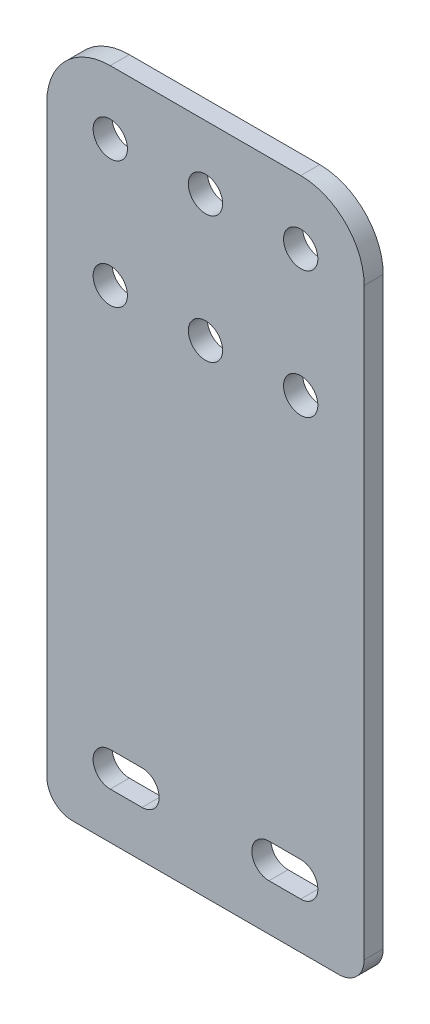
ISO-10303-21;
HEADER;
FILE_DESCRIPTION(('STEP AP214'),'2;1');
FILE_NAME('part.step','',(''),(''),'','','');
FILE_SCHEMA(('AUTOMOTIVE_DESIGN { 1 0 10303 214 1 1 1 1 }'));
ENDSEC;
DATA;
#1=APPLICATION_CONTEXT('core data for automotive mechanical design processes');
#2=APPLICATION_PROTOCOL_DEFINITION('international standard','automotive_design',2000,#1);
#3=PRODUCT_CONTEXT('',#1,'mechanical');
#4=PRODUCT('Part','Part','',(#3));
#5=PRODUCT_RELATED_PRODUCT_CATEGORY('part','',(#4));
#6=PRODUCT_DEFINITION_FORMATION('','',#4);
#7=PRODUCT_DEFINITION_CONTEXT('part definition',#1,'design');
#8=PRODUCT_DEFINITION('design','',#6,#7);
#9=PRODUCT_DEFINITION_SHAPE('','',#8);
#10=(LENGTH_UNIT() NAMED_UNIT(*) SI_UNIT(.MILLI.,.METRE.));
#11=(NAMED_UNIT(*) PLANE_ANGLE_UNIT() SI_UNIT($,.RADIAN.));
#12=(NAMED_UNIT(*) SI_UNIT($,.STERADIAN.) SOLID_ANGLE_UNIT());
#13=UNCERTAINTY_MEASURE_WITH_UNIT(LENGTH_MEASURE(1.E-05),#10,'distance_accuracy_value','');
#14=(GEOMETRIC_REPRESENTATION_CONTEXT(3) GLOBAL_UNCERTAINTY_ASSIGNED_CONTEXT((#13)) GLOBAL_UNIT_ASSIGNED_CONTEXT((#10,
#11,#12)) REPRESENTATION_CONTEXT('',''));
#15=CARTESIAN_POINT('',(0.,0.,0.));
#16=DIRECTION('',(0.,0.,1.));
#17=DIRECTION('',(1.,0.,0.));
#18=AXIS2_PLACEMENT_3D('',#15,#16,#17);
#19=CARTESIAN_POINT('',(10.,96.,3.));
#20=DIRECTION('',(0.,0.,1.));
#21=DIRECTION('',(1.,0.,0.));
#22=AXIS2_PLACEMENT_3D('',#19,#20,#21);
#23=PLANE('',#22);
#24=DIRECTION('',(1.,0.,0.));
#25=VECTOR('',#24,1.);
#26=CARTESIAN_POINT('',(15.,7.3,3.));
#27=LINE('',#26,#25);
#28=CARTESIAN_POINT('',(9.99999999999999,7.3,3.));
#29=VERTEX_POINT('',#28);
#30=CARTESIAN_POINT('',(15.,7.3,3.));
#31=VERTEX_POINT('',#30);
#32=EDGE_CURVE('E184',#29,#31,#27,.T.);
#33=ORIENTED_EDGE('',*,*,#32,.F.);
#34=CARTESIAN_POINT('',(10.,10.,3.));
#35=DIRECTION('',(0.,0.,1.));
#36=DIRECTION('',(1.,0.,0.));
#37=AXIS2_PLACEMENT_3D('',#34,#35,#36);
#38=CIRCLE('',#37,2.7);
#39=CARTESIAN_POINT('',(10.,12.7,3.));
#40=VERTEX_POINT('',#39);
#41=EDGE_CURVE('E182',#40,#29,#38,.T.);
#42=ORIENTED_EDGE('',*,*,#41,.F.);
#43=DIRECTION('',(-1.,0.,0.));
#44=VECTOR('',#43,1.);
#45=CARTESIAN_POINT('',(10.,12.7,3.));
#46=LINE('',#45,#44);
#47=CARTESIAN_POINT('',(15.,12.7,3.));
#48=VERTEX_POINT('',#47);
#49=EDGE_CURVE('E190',#48,#40,#46,.T.);
#50=ORIENTED_EDGE('',*,*,#49,.F.);
#51=CARTESIAN_POINT('',(15.,10.,3.));
#52=DIRECTION('',(0.,0.,1.));
#53=DIRECTION('',(1.,0.,0.));
#54=AXIS2_PLACEMENT_3D('',#51,#52,#53);
#55=CIRCLE('',#54,2.7);
#56=EDGE_CURVE('E187',#31,#48,#55,.T.);
#57=ORIENTED_EDGE('',*,*,#56,.F.);
#58=EDGE_LOOP('',(#33,#42,#50,#57));
#59=FACE_BOUND('',#58,.T.);
#60=CARTESIAN_POINT('',(10.,76.,3.));
#61=DIRECTION('',(0.,0.,1.));
#62=DIRECTION('',(1.,0.,0.));
#63=AXIS2_PLACEMENT_3D('',#60,#61,#62);
#64=CIRCLE('',#63,2.7);
#65=CARTESIAN_POINT('',(12.7,76.,3.));
#66=VERTEX_POINT('',#65);
#67=EDGE_CURVE('E219',#66,#66,#64,.T.);
#68=ORIENTED_EDGE('',*,*,#67,.F.);
#69=EDGE_LOOP('',(#68));
#70=FACE_BOUND('',#69,.T.);
#71=CARTESIAN_POINT('',(40.,76.,3.));
#72=DIRECTION('',(0.,0.,1.));
#73=DIRECTION('',(1.,0.,0.));
#74=AXIS2_PLACEMENT_3D('',#71,#72,#73);
#75=CIRCLE('',#74,2.7);
#76=CARTESIAN_POINT('',(42.7,76.,3.));
#77=VERTEX_POINT('',#76);
#78=EDGE_CURVE('E231',#77,#77,#75,.T.);
#79=ORIENTED_EDGE('',*,*,#78,.F.);
#80=EDGE_LOOP('',(#79));
#81=FACE_BOUND('',#80,.T.);
#82=CARTESIAN_POINT('',(25.,76.,3.));
#83=DIRECTION('',(0.,0.,1.));
#84=DIRECTION('',(1.,0.,0.));
#85=AXIS2_PLACEMENT_3D('',#82,#83,#84);
#86=CIRCLE('',#85,2.7);
#87=CARTESIAN_POINT('',(27.7,76.,3.));
#88=VERTEX_POINT('',#87);
#89=EDGE_CURVE('E243',#88,#88,#86,.T.);
#90=ORIENTED_EDGE('',*,*,#89,.F.);
#91=EDGE_LOOP('',(#90));
#92=FACE_BOUND('',#91,.T.);
#93=CARTESIAN_POINT('',(10.,96.,3.));
#94=DIRECTION('',(0.,0.,1.));
#95=DIRECTION('',(1.,0.,0.));
#96=AXIS2_PLACEMENT_3D('',#93,#94,#95);
#97=CIRCLE('',#96,10.);
#98=CARTESIAN_POINT('',(10.,106.,3.));
#99=VERTEX_POINT('',#98);
#100=CARTESIAN_POINT('',(0.,96.,3.));
#101=VERTEX_POINT('',#100);
#102=EDGE_CURVE('E249',#99,#101,#97,.T.);
#103=ORIENTED_EDGE('',*,*,#102,.T.);
#104=DIRECTION('',(0.,-1.,0.));
#105=VECTOR('',#104,1.);
#106=CARTESIAN_POINT('',(0.,96.,3.));
#107=LINE('',#106,#105);
#108=CARTESIAN_POINT('',(0.,4.,3.));
#109=VERTEX_POINT('',#108);
#110=EDGE_CURVE('E252',#101,#109,#107,.T.);
#111=ORIENTED_EDGE('',*,*,#110,.T.);
#112=CARTESIAN_POINT('',(4.,4.,3.));
#113=DIRECTION('',(0.,0.,1.));
#114=DIRECTION('',(1.,0.,0.));
#115=AXIS2_PLACEMENT_3D('',#112,#113,#114);
#116=CIRCLE('',#115,4.);
#117=CARTESIAN_POINT('',(4.,0.,3.));
#118=VERTEX_POINT('',#117);
#119=EDGE_CURVE('E255',#109,#118,#116,.T.);
#120=ORIENTED_EDGE('',*,*,#119,.T.);
#121=DIRECTION('',(1.,0.,0.));
#122=VECTOR('',#121,1.);
#123=CARTESIAN_POINT('',(4.,0.,3.));
#124=LINE('',#123,#122);
#125=CARTESIAN_POINT('',(46.,0.,3.));
#126=VERTEX_POINT('',#125);
#127=EDGE_CURVE('E257',#118,#126,#124,.T.);
#128=ORIENTED_EDGE('',*,*,#127,.T.);
#129=CARTESIAN_POINT('',(46.,4.,3.));
#130=DIRECTION('',(0.,0.,1.));
#131=DIRECTION('',(1.,0.,0.));
#132=AXIS2_PLACEMENT_3D('',#129,#130,#131);
#133=CIRCLE('',#132,4.);
#134=CARTESIAN_POINT('',(50.,4.,3.));
#135=VERTEX_POINT('',#134);
#136=EDGE_CURVE('E259',#126,#135,#133,.T.);
#137=ORIENTED_EDGE('',*,*,#136,.T.);
#138=DIRECTION('',(0.,1.,0.));
#139=VECTOR('',#138,1.);
#140=CARTESIAN_POINT('',(50.,4.,3.));
#141=LINE('',#140,#139);
#142=CARTESIAN_POINT('',(50.,96.,3.));
#143=VERTEX_POINT('',#142);
#144=EDGE_CURVE('E261',#135,#143,#141,.T.);
#145=ORIENTED_EDGE('',*,*,#144,.T.);
#146=CARTESIAN_POINT('',(40.,96.,3.));
#147=DIRECTION('',(0.,0.,1.));
#148=DIRECTION('',(1.,0.,0.));
#149=AXIS2_PLACEMENT_3D('',#146,#147,#148);
#150=CIRCLE('',#149,10.);
#151=CARTESIAN_POINT('',(40.,106.,3.));
#152=VERTEX_POINT('',#151);
#153=EDGE_CURVE('E263',#143,#152,#150,.T.);
#154=ORIENTED_EDGE('',*,*,#153,.T.);
#155=DIRECTION('',(-1.,0.,0.));
#156=VECTOR('',#155,1.);
#157=CARTESIAN_POINT('',(40.,106.,3.));
#158=LINE('',#157,#156);
#159=EDGE_CURVE('E265',#152,#99,#158,.T.);
#160=ORIENTED_EDGE('',*,*,#159,.T.);
#161=EDGE_LOOP('',(#103,#111,#120,#128,#137,#145,#154,#160));
#162=FACE_BOUND('',#161,.T.);
#163=CARTESIAN_POINT('',(25.,96.,3.));
#164=DIRECTION('',(0.,0.,1.));
#165=DIRECTION('',(1.,0.,0.));
#166=AXIS2_PLACEMENT_3D('',#163,#164,#165);
#167=CIRCLE('',#166,2.7);
#168=CARTESIAN_POINT('',(27.7,96.,3.));
#169=VERTEX_POINT('',#168);
#170=EDGE_CURVE('E237',#169,#169,#167,.T.);
#171=ORIENTED_EDGE('',*,*,#170,.F.);
#172=EDGE_LOOP('',(#171));
#173=FACE_BOUND('',#172,.T.);
#174=CARTESIAN_POINT('',(40.,96.,3.));
#175=DIRECTION('',(0.,0.,1.));
#176=DIRECTION('',(1.,0.,0.));
#177=AXIS2_PLACEMENT_3D('',#174,#175,#176);
#178=CIRCLE('',#177,2.7);
#179=CARTESIAN_POINT('',(42.7,96.,3.));
#180=VERTEX_POINT('',#179);
#181=EDGE_CURVE('E225',#180,#180,#178,.T.);
#182=ORIENTED_EDGE('',*,*,#181,.F.);
#183=EDGE_LOOP('',(#182));
#184=FACE_BOUND('',#183,.T.);
#185=CARTESIAN_POINT('',(10.,96.,3.));
#186=DIRECTION('',(0.,0.,1.));
#187=DIRECTION('',(1.,0.,0.));
#188=AXIS2_PLACEMENT_3D('',#185,#186,#187);
#189=CIRCLE('',#188,2.7);
#190=CARTESIAN_POINT('',(12.7,96.,3.));
#191=VERTEX_POINT('',#190);
#192=EDGE_CURVE('E213',#191,#191,#189,.T.);
#193=ORIENTED_EDGE('',*,*,#192,.F.);
#194=EDGE_LOOP('',(#193));
#195=FACE_BOUND('',#194,.T.);
#196=DIRECTION('',(1.,0.,0.));
#197=VECTOR('',#196,1.);
#198=CARTESIAN_POINT('',(40.,7.3,3.));
#199=LINE('',#198,#197);
#200=CARTESIAN_POINT('',(35.,7.3,3.));
#201=VERTEX_POINT('',#200);
#202=CARTESIAN_POINT('',(40.,7.3,3.));
#203=VERTEX_POINT('',#202);
#204=EDGE_CURVE('E154',#201,#203,#199,.T.);
#205=ORIENTED_EDGE('',*,*,#204,.F.);
#206=CARTESIAN_POINT('',(35.,10.,3.));
#207=DIRECTION('',(0.,0.,1.));
#208=DIRECTION('',(1.,0.,0.));
#209=AXIS2_PLACEMENT_3D('',#206,#207,#208);
#210=CIRCLE('',#209,2.7);
#211=CARTESIAN_POINT('',(35.,12.7,3.));
#212=VERTEX_POINT('',#211);
#213=EDGE_CURVE('E146',#212,#201,#210,.T.);
#214=ORIENTED_EDGE('',*,*,#213,.F.);
#215=DIRECTION('',(-1.,0.,0.));
#216=VECTOR('',#215,1.);
#217=CARTESIAN_POINT('',(35.,12.7,3.));
#218=LINE('',#217,#216);
#219=CARTESIAN_POINT('',(40.,12.7,3.));
#220=VERTEX_POINT('',#219);
#221=EDGE_CURVE('E168',#220,#212,#218,.T.);
#222=ORIENTED_EDGE('',*,*,#221,.F.);
#223=CARTESIAN_POINT('',(40.,10.,3.));
#224=DIRECTION('',(0.,0.,1.));
#225=DIRECTION('',(1.,0.,0.));
#226=AXIS2_PLACEMENT_3D('',#223,#224,#225);
#227=CIRCLE('',#226,2.7);
#228=EDGE_CURVE('E166',#203,#220,#227,.T.);
#229=ORIENTED_EDGE('',*,*,#228,.F.);
#230=EDGE_LOOP('',(#205,#214,#222,#229));
#231=FACE_BOUND('',#230,.T.);
#232=ADVANCED_FACE('F33',(#59,#70,#81,#92,#162,#173,#184,#195,#231),#23,.T.);
#233=CARTESIAN_POINT('',(10.,96.,0.));
#234=DIRECTION('',(0.,0.,1.));
#235=DIRECTION('',(1.,0.,0.));
#236=AXIS2_PLACEMENT_3D('',#233,#234,#235);
#237=PLANE('',#236);
#238=CARTESIAN_POINT('',(10.,10.,0.));
#239=DIRECTION('',(0.,0.,1.));
#240=DIRECTION('',(1.,0.,0.));
#241=AXIS2_PLACEMENT_3D('',#238,#239,#240);
#242=CIRCLE('',#241,2.7);
#243=CARTESIAN_POINT('',(10.,12.7,0.));
#244=VERTEX_POINT('',#243);
#245=CARTESIAN_POINT('',(9.99999999999999,7.3,0.));
#246=VERTEX_POINT('',#245);
#247=EDGE_CURVE('E162',#244,#246,#242,.T.);
#248=ORIENTED_EDGE('',*,*,#247,.T.);
#249=DIRECTION('',(1.,0.,0.));
#250=VECTOR('',#249,1.);
#251=CARTESIAN_POINT('',(15.,7.3,0.));
#252=LINE('',#251,#250);
#253=CARTESIAN_POINT('',(15.,7.3,0.));
#254=VERTEX_POINT('',#253);
#255=EDGE_CURVE('E195',#246,#254,#252,.T.);
#256=ORIENTED_EDGE('',*,*,#255,.T.);
#257=CARTESIAN_POINT('',(15.,10.,0.));
#258=DIRECTION('',(0.,0.,1.));
#259=DIRECTION('',(1.,0.,0.));
#260=AXIS2_PLACEMENT_3D('',#257,#258,#259);
#261=CIRCLE('',#260,2.7);
#262=CARTESIAN_POINT('',(15.,12.7,0.));
#263=VERTEX_POINT('',#262);
#264=EDGE_CURVE('E198',#254,#263,#261,.T.);
#265=ORIENTED_EDGE('',*,*,#264,.T.);
#266=DIRECTION('',(-1.,0.,0.));
#267=VECTOR('',#266,1.);
#268=CARTESIAN_POINT('',(10.,12.7,0.));
#269=LINE('',#268,#267);
#270=EDGE_CURVE('E185',#263,#244,#269,.T.);
#271=ORIENTED_EDGE('',*,*,#270,.T.);
#272=EDGE_LOOP('',(#248,#256,#265,#271));
#273=FACE_BOUND('',#272,.T.);
#274=CARTESIAN_POINT('',(10.,76.,0.));
#275=DIRECTION('',(0.,0.,1.));
#276=DIRECTION('',(1.,0.,0.));
#277=AXIS2_PLACEMENT_3D('',#274,#275,#276);
#278=CIRCLE('',#277,2.7);
#279=CARTESIAN_POINT('',(12.7,76.,0.));
#280=VERTEX_POINT('',#279);
#281=EDGE_CURVE('E216',#280,#280,#278,.T.);
#282=ORIENTED_EDGE('',*,*,#281,.T.);
#283=EDGE_LOOP('',(#282));
#284=FACE_BOUND('',#283,.T.);
#285=CARTESIAN_POINT('',(40.,76.,0.));
#286=DIRECTION('',(0.,0.,1.));
#287=DIRECTION('',(1.,0.,0.));
#288=AXIS2_PLACEMENT_3D('',#285,#286,#287);
#289=CIRCLE('',#288,2.7);
#290=CARTESIAN_POINT('',(42.7,76.,0.));
#291=VERTEX_POINT('',#290);
#292=EDGE_CURVE('E228',#291,#291,#289,.T.);
#293=ORIENTED_EDGE('',*,*,#292,.T.);
#294=EDGE_LOOP('',(#293));
#295=FACE_BOUND('',#294,.T.);
#296=CARTESIAN_POINT('',(25.,76.,0.));
#297=DIRECTION('',(0.,0.,1.));
#298=DIRECTION('',(1.,0.,0.));
#299=AXIS2_PLACEMENT_3D('',#296,#297,#298);
#300=CIRCLE('',#299,2.7);
#301=CARTESIAN_POINT('',(27.7,76.,0.));
#302=VERTEX_POINT('',#301);
#303=EDGE_CURVE('E240',#302,#302,#300,.T.);
#304=ORIENTED_EDGE('',*,*,#303,.T.);
#305=EDGE_LOOP('',(#304));
#306=FACE_BOUND('',#305,.T.);
#307=CARTESIAN_POINT('',(10.,96.,0.));
#308=DIRECTION('',(0.,0.,1.));
#309=DIRECTION('',(1.,0.,0.));
#310=AXIS2_PLACEMENT_3D('',#307,#308,#309);
#311=CIRCLE('',#310,10.);
#312=CARTESIAN_POINT('',(10.,106.,0.));
#313=VERTEX_POINT('',#312);
#314=CARTESIAN_POINT('',(0.,96.,0.));
#315=VERTEX_POINT('',#314);
#316=EDGE_CURVE('E246',#313,#315,#311,.T.);
#317=ORIENTED_EDGE('',*,*,#316,.F.);
#318=DIRECTION('',(-1.,0.,0.));
#319=VECTOR('',#318,1.);
#320=CARTESIAN_POINT('',(40.,106.,0.));
#321=LINE('',#320,#319);
#322=CARTESIAN_POINT('',(40.,106.,0.));
#323=VERTEX_POINT('',#322);
#324=EDGE_CURVE('E253',#323,#313,#321,.T.);
#325=ORIENTED_EDGE('',*,*,#324,.F.);
#326=CARTESIAN_POINT('',(40.,96.,0.));
#327=DIRECTION('',(0.,0.,1.));
#328=DIRECTION('',(1.,0.,0.));
#329=AXIS2_PLACEMENT_3D('',#326,#327,#328);
#330=CIRCLE('',#329,10.);
#331=CARTESIAN_POINT('',(50.,96.,0.));
#332=VERTEX_POINT('',#331);
#333=EDGE_CURVE('E280',#332,#323,#330,.T.);
#334=ORIENTED_EDGE('',*,*,#333,.F.);
#335=DIRECTION('',(0.,1.,0.));
#336=VECTOR('',#335,1.);
#337=CARTESIAN_POINT('',(50.,4.,0.));
#338=LINE('',#337,#336);
#339=CARTESIAN_POINT('',(50.,4.,0.));
#340=VERTEX_POINT('',#339);
#341=EDGE_CURVE('E278',#340,#332,#338,.T.);
#342=ORIENTED_EDGE('',*,*,#341,.F.);
#343=CARTESIAN_POINT('',(46.,4.,0.));
#344=DIRECTION('',(0.,0.,1.));
#345=DIRECTION('',(1.,0.,0.));
#346=AXIS2_PLACEMENT_3D('',#343,#344,#345);
#347=CIRCLE('',#346,4.);
#348=CARTESIAN_POINT('',(46.,0.,0.));
#349=VERTEX_POINT('',#348);
#350=EDGE_CURVE('E276',#349,#340,#347,.T.);
#351=ORIENTED_EDGE('',*,*,#350,.F.);
#352=DIRECTION('',(1.,0.,0.));
#353=VECTOR('',#352,1.);
#354=CARTESIAN_POINT('',(4.,0.,0.));
#355=LINE('',#354,#353);
#356=CARTESIAN_POINT('',(4.,0.,0.));
#357=VERTEX_POINT('',#356);
#358=EDGE_CURVE('E274',#357,#349,#355,.T.);
#359=ORIENTED_EDGE('',*,*,#358,.F.);
#360=CARTESIAN_POINT('',(4.,4.,0.));
#361=DIRECTION('',(0.,0.,1.));
#362=DIRECTION('',(1.,0.,0.));
#363=AXIS2_PLACEMENT_3D('',#360,#361,#362);
#364=CIRCLE('',#363,4.);
#365=CARTESIAN_POINT('',(0.,4.,0.));
#366=VERTEX_POINT('',#365);
#367=EDGE_CURVE('E272',#366,#357,#364,.T.);
#368=ORIENTED_EDGE('',*,*,#367,.F.);
#369=DIRECTION('',(0.,-1.,0.));
#370=VECTOR('',#369,1.);
#371=CARTESIAN_POINT('',(0.,96.,0.));
#372=LINE('',#371,#370);
#373=EDGE_CURVE('E270',#315,#366,#372,.T.);
#374=ORIENTED_EDGE('',*,*,#373,.F.);
#375=EDGE_LOOP('',(#317,#325,#334,#342,#351,#359,#368,#374));
#376=FACE_BOUND('',#375,.T.);
#377=CARTESIAN_POINT('',(25.,96.,0.));
#378=DIRECTION('',(0.,0.,1.));
#379=DIRECTION('',(1.,0.,0.));
#380=AXIS2_PLACEMENT_3D('',#377,#378,#379);
#381=CIRCLE('',#380,2.7);
#382=CARTESIAN_POINT('',(27.7,96.,0.));
#383=VERTEX_POINT('',#382);
#384=EDGE_CURVE('E234',#383,#383,#381,.T.);
#385=ORIENTED_EDGE('',*,*,#384,.T.);
#386=EDGE_LOOP('',(#385));
#387=FACE_BOUND('',#386,.T.);
#388=CARTESIAN_POINT('',(40.,96.,0.));
#389=DIRECTION('',(0.,0.,1.));
#390=DIRECTION('',(1.,0.,0.));
#391=AXIS2_PLACEMENT_3D('',#388,#389,#390);
#392=CIRCLE('',#391,2.7);
#393=CARTESIAN_POINT('',(42.7,96.,0.));
#394=VERTEX_POINT('',#393);
#395=EDGE_CURVE('E222',#394,#394,#392,.T.);
#396=ORIENTED_EDGE('',*,*,#395,.T.);
#397=EDGE_LOOP('',(#396));
#398=FACE_BOUND('',#397,.T.);
#399=CARTESIAN_POINT('',(10.,96.,0.));
#400=DIRECTION('',(0.,0.,1.));
#401=DIRECTION('',(1.,0.,0.));
#402=AXIS2_PLACEMENT_3D('',#399,#400,#401);
#403=CIRCLE('',#402,2.7);
#404=CARTESIAN_POINT('',(12.7,96.,0.));
#405=VERTEX_POINT('',#404);
#406=EDGE_CURVE('E212',#405,#405,#403,.T.);
#407=ORIENTED_EDGE('',*,*,#406,.T.);
#408=EDGE_LOOP('',(#407));
#409=FACE_BOUND('',#408,.T.);
#410=CARTESIAN_POINT('',(35.,10.,0.));
#411=DIRECTION('',(0.,0.,1.));
#412=DIRECTION('',(1.,0.,0.));
#413=AXIS2_PLACEMENT_3D('',#410,#411,#412);
#414=CIRCLE('',#413,2.7);
#415=CARTESIAN_POINT('',(35.,12.7,0.));
#416=VERTEX_POINT('',#415);
#417=CARTESIAN_POINT('',(35.,7.3,0.));
#418=VERTEX_POINT('',#417);
#419=EDGE_CURVE('E56',#416,#418,#414,.T.);
#420=ORIENTED_EDGE('',*,*,#419,.T.);
#421=DIRECTION('',(1.,0.,0.));
#422=VECTOR('',#421,1.);
#423=CARTESIAN_POINT('',(40.,7.3,0.));
#424=LINE('',#423,#422);
#425=CARTESIAN_POINT('',(40.,7.3,0.));
#426=VERTEX_POINT('',#425);
#427=EDGE_CURVE('E161',#418,#426,#424,.T.);
#428=ORIENTED_EDGE('',*,*,#427,.T.);
#429=CARTESIAN_POINT('',(40.,10.,0.));
#430=DIRECTION('',(0.,0.,1.));
#431=DIRECTION('',(1.,0.,0.));
#432=AXIS2_PLACEMENT_3D('',#429,#430,#431);
#433=CIRCLE('',#432,2.7);
#434=CARTESIAN_POINT('',(40.,12.7,0.));
#435=VERTEX_POINT('',#434);
#436=EDGE_CURVE('E174',#426,#435,#433,.T.);
#437=ORIENTED_EDGE('',*,*,#436,.T.);
#438=DIRECTION('',(-1.,0.,0.));
#439=VECTOR('',#438,1.);
#440=CARTESIAN_POINT('',(35.,12.7,0.));
#441=LINE('',#440,#439);
#442=EDGE_CURVE('E155',#435,#416,#441,.T.);
#443=ORIENTED_EDGE('',*,*,#442,.T.);
#444=EDGE_LOOP('',(#420,#428,#437,#443));
#445=FACE_BOUND('',#444,.T.);
#446=ADVANCED_FACE('F310',(#273,#284,#295,#306,#376,#387,#398,#409,#445),#237,.F.);
#447=CARTESIAN_POINT('',(10.,96.,3.));
#448=DIRECTION('',(0.,0.,-1.));
#449=DIRECTION('',(-1.,0.,0.));
#450=AXIS2_PLACEMENT_3D('',#447,#448,#449);
#451=CYLINDRICAL_SURFACE('',#450,10.);
#452=ORIENTED_EDGE('',*,*,#316,.T.);
#453=DIRECTION('',(0.,0.,-1.));
#454=VECTOR('',#453,1.);
#455=CARTESIAN_POINT('',(0.,96.,3.));
#456=LINE('',#455,#454);
#457=EDGE_CURVE('E11',#101,#315,#456,.T.);
#458=ORIENTED_EDGE('',*,*,#457,.F.);
#459=ORIENTED_EDGE('',*,*,#102,.F.);
#460=DIRECTION('',(0.,0.,-1.));
#461=VECTOR('',#460,1.);
#462=CARTESIAN_POINT('',(10.,106.,3.));
#463=LINE('',#462,#461);
#464=EDGE_CURVE('E267',#99,#313,#463,.T.);
#465=ORIENTED_EDGE('',*,*,#464,.T.);
#466=EDGE_LOOP('',(#452,#458,#459,#465));
#467=FACE_BOUND('',#466,.T.);
#468=ADVANCED_FACE('F35',(#467),#451,.T.);
#469=CARTESIAN_POINT('',(0.,96.,3.));
#470=DIRECTION('',(1.,0.,0.));
#471=DIRECTION('',(0.,1.,0.));
#472=AXIS2_PLACEMENT_3D('',#469,#470,#471);
#473=PLANE('',#472);
#474=ORIENTED_EDGE('',*,*,#373,.T.);
#475=DIRECTION('',(0.,0.,-1.));
#476=VECTOR('',#475,1.);
#477=CARTESIAN_POINT('',(0.,4.,3.));
#478=LINE('',#477,#476);
#479=EDGE_CURVE('E41',#109,#366,#478,.T.);
#480=ORIENTED_EDGE('',*,*,#479,.F.);
#481=ORIENTED_EDGE('',*,*,#110,.F.);
#482=ORIENTED_EDGE('',*,*,#457,.T.);
#483=EDGE_LOOP('',(#474,#480,#481,#482));
#484=FACE_BOUND('',#483,.T.);
#485=ADVANCED_FACE('F328',(#484),#473,.F.);
#486=CARTESIAN_POINT('',(4.,4.,3.));
#487=DIRECTION('',(0.,0.,-1.));
#488=DIRECTION('',(-1.,0.,0.));
#489=AXIS2_PLACEMENT_3D('',#486,#487,#488);
#490=CYLINDRICAL_SURFACE('',#489,4.);
#491=ORIENTED_EDGE('',*,*,#367,.T.);
#492=DIRECTION('',(0.,0.,-1.));
#493=VECTOR('',#492,1.);
#494=CARTESIAN_POINT('',(4.,0.,3.));
#495=LINE('',#494,#493);
#496=EDGE_CURVE('E297',#118,#357,#495,.T.);
#497=ORIENTED_EDGE('',*,*,#496,.F.);
#498=ORIENTED_EDGE('',*,*,#119,.F.);
#499=ORIENTED_EDGE('',*,*,#479,.T.);
#500=EDGE_LOOP('',(#491,#497,#498,#499));
#501=FACE_BOUND('',#500,.T.);
#502=ADVANCED_FACE('F304',(#501),#490,.T.);
#503=CARTESIAN_POINT('',(4.,0.,3.));
#504=DIRECTION('',(0.,1.,0.));
#505=DIRECTION('',(0.,0.,1.));
#506=AXIS2_PLACEMENT_3D('',#503,#504,#505);
#507=PLANE('',#506);
#508=ORIENTED_EDGE('',*,*,#358,.T.);
#509=DIRECTION('',(0.,0.,-1.));
#510=VECTOR('',#509,1.);
#511=CARTESIAN_POINT('',(46.,0.,3.));
#512=LINE('',#511,#510);
#513=EDGE_CURVE('E294',#126,#349,#512,.T.);
#514=ORIENTED_EDGE('',*,*,#513,.F.);
#515=ORIENTED_EDGE('',*,*,#127,.F.);
#516=ORIENTED_EDGE('',*,*,#496,.T.);
#517=EDGE_LOOP('',(#508,#514,#515,#516));
#518=FACE_BOUND('',#517,.T.);
#519=ADVANCED_FACE('F316',(#518),#507,.F.);
#520=CARTESIAN_POINT('',(46.,4.,3.));
#521=DIRECTION('',(0.,0.,-1.));
#522=DIRECTION('',(-1.,0.,0.));
#523=AXIS2_PLACEMENT_3D('',#520,#521,#522);
#524=CYLINDRICAL_SURFACE('',#523,4.);
#525=ORIENTED_EDGE('',*,*,#350,.T.);
#526=DIRECTION('',(0.,0.,-1.));
#527=VECTOR('',#526,1.);
#528=CARTESIAN_POINT('',(50.,4.,3.));
#529=LINE('',#528,#527);
#530=EDGE_CURVE('E291',#135,#340,#529,.T.);
#531=ORIENTED_EDGE('',*,*,#530,.F.);
#532=ORIENTED_EDGE('',*,*,#136,.F.);
#533=ORIENTED_EDGE('',*,*,#513,.T.);
#534=EDGE_LOOP('',(#525,#531,#532,#533));
#535=FACE_BOUND('',#534,.T.);
#536=ADVANCED_FACE('F320',(#535),#524,.T.);
#537=CARTESIAN_POINT('',(50.,4.,3.));
#538=DIRECTION('',(-1.,0.,0.));
#539=DIRECTION('',(0.,0.,1.));
#540=AXIS2_PLACEMENT_3D('',#537,#538,#539);
#541=PLANE('',#540);
#542=ORIENTED_EDGE('',*,*,#341,.T.);
#543=DIRECTION('',(0.,0.,-1.));
#544=VECTOR('',#543,1.);
#545=CARTESIAN_POINT('',(50.,96.,3.));
#546=LINE('',#545,#544);
#547=EDGE_CURVE('E288',#143,#332,#546,.T.);
#548=ORIENTED_EDGE('',*,*,#547,.F.);
#549=ORIENTED_EDGE('',*,*,#144,.F.);
#550=ORIENTED_EDGE('',*,*,#530,.T.);
#551=EDGE_LOOP('',(#542,#548,#549,#550));
#552=FACE_BOUND('',#551,.T.);
#553=ADVANCED_FACE('F341',(#552),#541,.F.);
#554=CARTESIAN_POINT('',(40.,96.,3.));
#555=DIRECTION('',(0.,0.,-1.));
#556=DIRECTION('',(-1.,0.,0.));
#557=AXIS2_PLACEMENT_3D('',#554,#555,#556);
#558=CYLINDRICAL_SURFACE('',#557,10.);
#559=ORIENTED_EDGE('',*,*,#333,.T.);
#560=DIRECTION('',(0.,0.,-1.));
#561=VECTOR('',#560,1.);
#562=CARTESIAN_POINT('',(40.,106.,3.));
#563=LINE('',#562,#561);
#564=EDGE_CURVE('E285',#152,#323,#563,.T.);
#565=ORIENTED_EDGE('',*,*,#564,.F.);
#566=ORIENTED_EDGE('',*,*,#153,.F.);
#567=ORIENTED_EDGE('',*,*,#547,.T.);
#568=EDGE_LOOP('',(#559,#565,#566,#567));
#569=FACE_BOUND('',#568,.T.);
#570=ADVANCED_FACE('F339',(#569),#558,.T.);
#571=CARTESIAN_POINT('',(40.,106.,3.));
#572=DIRECTION('',(0.,-1.,0.));
#573=DIRECTION('',(0.,0.,-1.));
#574=AXIS2_PLACEMENT_3D('',#571,#572,#573);
#575=PLANE('',#574);
#576=ORIENTED_EDGE('',*,*,#324,.T.);
#577=ORIENTED_EDGE('',*,*,#464,.F.);
#578=ORIENTED_EDGE('',*,*,#159,.F.);
#579=ORIENTED_EDGE('',*,*,#564,.T.);
#580=EDGE_LOOP('',(#576,#577,#578,#579));
#581=FACE_BOUND('',#580,.T.);
#582=ADVANCED_FACE('F334',(#581),#575,.F.);
#583=CARTESIAN_POINT('',(25.,76.,3.));
#584=DIRECTION('',(0.,0.,-1.));
#585=DIRECTION('',(-1.,0.,0.));
#586=AXIS2_PLACEMENT_3D('',#583,#584,#585);
#587=CYLINDRICAL_SURFACE('',#586,2.7);
#588=ORIENTED_EDGE('',*,*,#89,.T.);
#589=EDGE_LOOP('',(#588));
#590=FACE_BOUND('',#589,.T.);
#591=ORIENTED_EDGE('',*,*,#303,.F.);
#592=EDGE_LOOP('',(#591));
#593=FACE_BOUND('',#592,.T.);
#594=ADVANCED_FACE('F361',(#590,#593),#587,.F.);
#595=CARTESIAN_POINT('',(25.,96.,3.));
#596=DIRECTION('',(0.,0.,-1.));
#597=DIRECTION('',(-1.,0.,0.));
#598=AXIS2_PLACEMENT_3D('',#595,#596,#597);
#599=CYLINDRICAL_SURFACE('',#598,2.7);
#600=ORIENTED_EDGE('',*,*,#170,.T.);
#601=EDGE_LOOP('',(#600));
#602=FACE_BOUND('',#601,.T.);
#603=ORIENTED_EDGE('',*,*,#384,.F.);
#604=EDGE_LOOP('',(#603));
#605=FACE_BOUND('',#604,.T.);
#606=ADVANCED_FACE('F368',(#602,#605),#599,.F.);
#607=CARTESIAN_POINT('',(40.,76.,3.));
#608=DIRECTION('',(0.,0.,-1.));
#609=DIRECTION('',(-1.,0.,0.));
#610=AXIS2_PLACEMENT_3D('',#607,#608,#609);
#611=CYLINDRICAL_SURFACE('',#610,2.7);
#612=ORIENTED_EDGE('',*,*,#78,.T.);
#613=EDGE_LOOP('',(#612));
#614=FACE_BOUND('',#613,.T.);
#615=ORIENTED_EDGE('',*,*,#292,.F.);
#616=EDGE_LOOP('',(#615));
#617=FACE_BOUND('',#616,.T.);
#618=ADVANCED_FACE('F373',(#614,#617),#611,.F.);
#619=CARTESIAN_POINT('',(40.,96.,3.));
#620=DIRECTION('',(0.,0.,-1.));
#621=DIRECTION('',(-1.,0.,0.));
#622=AXIS2_PLACEMENT_3D('',#619,#620,#621);
#623=CYLINDRICAL_SURFACE('',#622,2.7);
#624=ORIENTED_EDGE('',*,*,#181,.T.);
#625=EDGE_LOOP('',(#624));
#626=FACE_BOUND('',#625,.T.);
#627=ORIENTED_EDGE('',*,*,#395,.F.);
#628=EDGE_LOOP('',(#627));
#629=FACE_BOUND('',#628,.T.);
#630=ADVANCED_FACE('F383',(#626,#629),#623,.F.);
#631=CARTESIAN_POINT('',(10.,76.,3.));
#632=DIRECTION('',(0.,0.,-1.));
#633=DIRECTION('',(-1.,0.,0.));
#634=AXIS2_PLACEMENT_3D('',#631,#632,#633);
#635=CYLINDRICAL_SURFACE('',#634,2.7);
#636=ORIENTED_EDGE('',*,*,#67,.T.);
#637=EDGE_LOOP('',(#636));
#638=FACE_BOUND('',#637,.T.);
#639=ORIENTED_EDGE('',*,*,#281,.F.);
#640=EDGE_LOOP('',(#639));
#641=FACE_BOUND('',#640,.T.);
#642=ADVANCED_FACE('F390',(#638,#641),#635,.F.);
#643=CARTESIAN_POINT('',(10.,96.,3.));
#644=DIRECTION('',(0.,0.,-1.));
#645=DIRECTION('',(-1.,0.,0.));
#646=AXIS2_PLACEMENT_3D('',#643,#644,#645);
#647=CYLINDRICAL_SURFACE('',#646,2.7);
#648=ORIENTED_EDGE('',*,*,#192,.T.);
#649=EDGE_LOOP('',(#648));
#650=FACE_BOUND('',#649,.T.);
#651=ORIENTED_EDGE('',*,*,#406,.F.);
#652=EDGE_LOOP('',(#651));
#653=FACE_BOUND('',#652,.T.);
#654=ADVANCED_FACE('F394',(#650,#653),#647,.F.);
#655=CARTESIAN_POINT('',(10.,10.,3.));
#656=DIRECTION('',(0.,0.,-1.));
#657=DIRECTION('',(-1.,0.,0.));
#658=AXIS2_PLACEMENT_3D('',#655,#656,#657);
#659=CYLINDRICAL_SURFACE('',#658,2.7);
#660=ORIENTED_EDGE('',*,*,#247,.F.);
#661=DIRECTION('',(0.,0.,-1.));
#662=VECTOR('',#661,1.);
#663=CARTESIAN_POINT('',(10.,12.7,3.));
#664=LINE('',#663,#662);
#665=EDGE_CURVE('E192',#40,#244,#664,.T.);
#666=ORIENTED_EDGE('',*,*,#665,.F.);
#667=ORIENTED_EDGE('',*,*,#41,.T.);
#668=DIRECTION('',(0.,0.,-1.));
#669=VECTOR('',#668,1.);
#670=CARTESIAN_POINT('',(9.99999999999999,7.3,3.));
#671=LINE('',#670,#669);
#672=EDGE_CURVE('E209',#29,#246,#671,.T.);
#673=ORIENTED_EDGE('',*,*,#672,.T.);
#674=EDGE_LOOP('',(#660,#666,#667,#673));
#675=FACE_BOUND('',#674,.T.);
#676=ADVANCED_FACE('F398',(#675),#659,.F.);
#677=CARTESIAN_POINT('',(15.,7.3,3.));
#678=DIRECTION('',(0.,1.,0.));
#679=DIRECTION('',(0.,0.,1.));
#680=AXIS2_PLACEMENT_3D('',#677,#678,#679);
#681=PLANE('',#680);
#682=ORIENTED_EDGE('',*,*,#255,.F.);
#683=ORIENTED_EDGE('',*,*,#672,.F.);
#684=ORIENTED_EDGE('',*,*,#32,.T.);
#685=DIRECTION('',(0.,0.,-1.));
#686=VECTOR('',#685,1.);
#687=CARTESIAN_POINT('',(15.,7.3,3.));
#688=LINE('',#687,#686);
#689=EDGE_CURVE('E207',#31,#254,#688,.T.);
#690=ORIENTED_EDGE('',*,*,#689,.T.);
#691=EDGE_LOOP('',(#682,#683,#684,#690));
#692=FACE_BOUND('',#691,.T.);
#693=ADVANCED_FACE('F402',(#692),#681,.T.);
#694=CARTESIAN_POINT('',(15.,10.,3.));
#695=DIRECTION('',(0.,0.,-1.));
#696=DIRECTION('',(-1.,0.,0.));
#697=AXIS2_PLACEMENT_3D('',#694,#695,#696);
#698=CYLINDRICAL_SURFACE('',#697,2.7);
#699=ORIENTED_EDGE('',*,*,#264,.F.);
#700=ORIENTED_EDGE('',*,*,#689,.F.);
#701=ORIENTED_EDGE('',*,*,#56,.T.);
#702=DIRECTION('',(0.,0.,-1.));
#703=VECTOR('',#702,1.);
#704=CARTESIAN_POINT('',(15.,12.7,3.));
#705=LINE('',#704,#703);
#706=EDGE_CURVE('E205',#48,#263,#705,.T.);
#707=ORIENTED_EDGE('',*,*,#706,.T.);
#708=EDGE_LOOP('',(#699,#700,#701,#707));
#709=FACE_BOUND('',#708,.T.);
#710=ADVANCED_FACE('F406',(#709),#698,.F.);
#711=CARTESIAN_POINT('',(10.,12.7,3.));
#712=DIRECTION('',(0.,-1.,0.));
#713=DIRECTION('',(0.,0.,-1.));
#714=AXIS2_PLACEMENT_3D('',#711,#712,#713);
#715=PLANE('',#714);
#716=ORIENTED_EDGE('',*,*,#270,.F.);
#717=ORIENTED_EDGE('',*,*,#706,.F.);
#718=ORIENTED_EDGE('',*,*,#49,.T.);
#719=ORIENTED_EDGE('',*,*,#665,.T.);
#720=EDGE_LOOP('',(#716,#717,#718,#719));
#721=FACE_BOUND('',#720,.T.);
#722=ADVANCED_FACE('F410',(#721),#715,.T.);
#723=CARTESIAN_POINT('',(35.,10.,3.));
#724=DIRECTION('',(0.,0.,-1.));
#725=DIRECTION('',(-1.,0.,0.));
#726=AXIS2_PLACEMENT_3D('',#723,#724,#725);
#727=CYLINDRICAL_SURFACE('',#726,2.7);
#728=ORIENTED_EDGE('',*,*,#419,.F.);
#729=DIRECTION('',(0.,0.,-1.));
#730=VECTOR('',#729,1.);
#731=CARTESIAN_POINT('',(35.,12.7,3.));
#732=LINE('',#731,#730);
#733=EDGE_CURVE('E150',#212,#416,#732,.T.);
#734=ORIENTED_EDGE('',*,*,#733,.F.);
#735=ORIENTED_EDGE('',*,*,#213,.T.);
#736=DIRECTION('',(0.,0.,-1.));
#737=VECTOR('',#736,1.);
#738=CARTESIAN_POINT('',(35.,7.3,3.));
#739=LINE('',#738,#737);
#740=EDGE_CURVE('E149',#201,#418,#739,.T.);
#741=ORIENTED_EDGE('',*,*,#740,.T.);
#742=EDGE_LOOP('',(#728,#734,#735,#741));
#743=FACE_BOUND('',#742,.T.);
#744=ADVANCED_FACE('F148',(#743),#727,.F.);
#745=CARTESIAN_POINT('',(40.,7.3,3.));
#746=DIRECTION('',(0.,1.,0.));
#747=DIRECTION('',(-1.,0.,0.));
#748=AXIS2_PLACEMENT_3D('',#745,#746,#747);
#749=PLANE('',#748);
#750=ORIENTED_EDGE('',*,*,#427,.F.);
#751=ORIENTED_EDGE('',*,*,#740,.F.);
#752=ORIENTED_EDGE('',*,*,#204,.T.);
#753=DIRECTION('',(0.,0.,-1.));
#754=VECTOR('',#753,1.);
#755=CARTESIAN_POINT('',(40.,7.3,3.));
#756=LINE('',#755,#754);
#757=EDGE_CURVE('E163',#203,#426,#756,.T.);
#758=ORIENTED_EDGE('',*,*,#757,.T.);
#759=EDGE_LOOP('',(#750,#751,#752,#758));
#760=FACE_BOUND('',#759,.T.);
#761=ADVANCED_FACE('F158',(#760),#749,.T.);
#762=CARTESIAN_POINT('',(40.,10.,3.));
#763=DIRECTION('',(0.,0.,-1.));
#764=DIRECTION('',(-1.,0.,0.));
#765=AXIS2_PLACEMENT_3D('',#762,#763,#764);
#766=CYLINDRICAL_SURFACE('',#765,2.7);
#767=ORIENTED_EDGE('',*,*,#436,.F.);
#768=ORIENTED_EDGE('',*,*,#757,.F.);
#769=ORIENTED_EDGE('',*,*,#228,.T.);
#770=DIRECTION('',(0.,0.,-1.));
#771=VECTOR('',#770,1.);
#772=CARTESIAN_POINT('',(40.,12.7,3.));
#773=LINE('',#772,#771);
#774=EDGE_CURVE('E48',#220,#435,#773,.T.);
#775=ORIENTED_EDGE('',*,*,#774,.T.);
#776=EDGE_LOOP('',(#767,#768,#769,#775));
#777=FACE_BOUND('',#776,.T.);
#778=ADVANCED_FACE('F419',(#777),#766,.F.);
#779=CARTESIAN_POINT('',(35.,12.7,3.));
#780=DIRECTION('',(0.,-1.,0.));
#781=DIRECTION('',(0.,0.,-1.));
#782=AXIS2_PLACEMENT_3D('',#779,#780,#781);
#783=PLANE('',#782);
#784=ORIENTED_EDGE('',*,*,#442,.F.);
#785=ORIENTED_EDGE('',*,*,#774,.F.);
#786=ORIENTED_EDGE('',*,*,#221,.T.);
#787=ORIENTED_EDGE('',*,*,#733,.T.);
#788=EDGE_LOOP('',(#784,#785,#786,#787));
#789=FACE_BOUND('',#788,.T.);
#790=ADVANCED_FACE('F422',(#789),#783,.T.);
#791=CLOSED_SHELL('',(#232,#446,#468,#485,#502,#519,#536,#553,#570,#582,#594,#606,#618,#630,
#642,#654,#676,#693,#710,#722,#744,#761,#778,#790));
#792=MANIFOLD_SOLID_BREP('B2',#791);
#793=ADVANCED_BREP_SHAPE_REPRESENTATION('',(#18,#792),#14);
#794=SHAPE_DEFINITION_REPRESENTATION(#9,#793);
ENDSEC;
END-ISO-10303-21;
